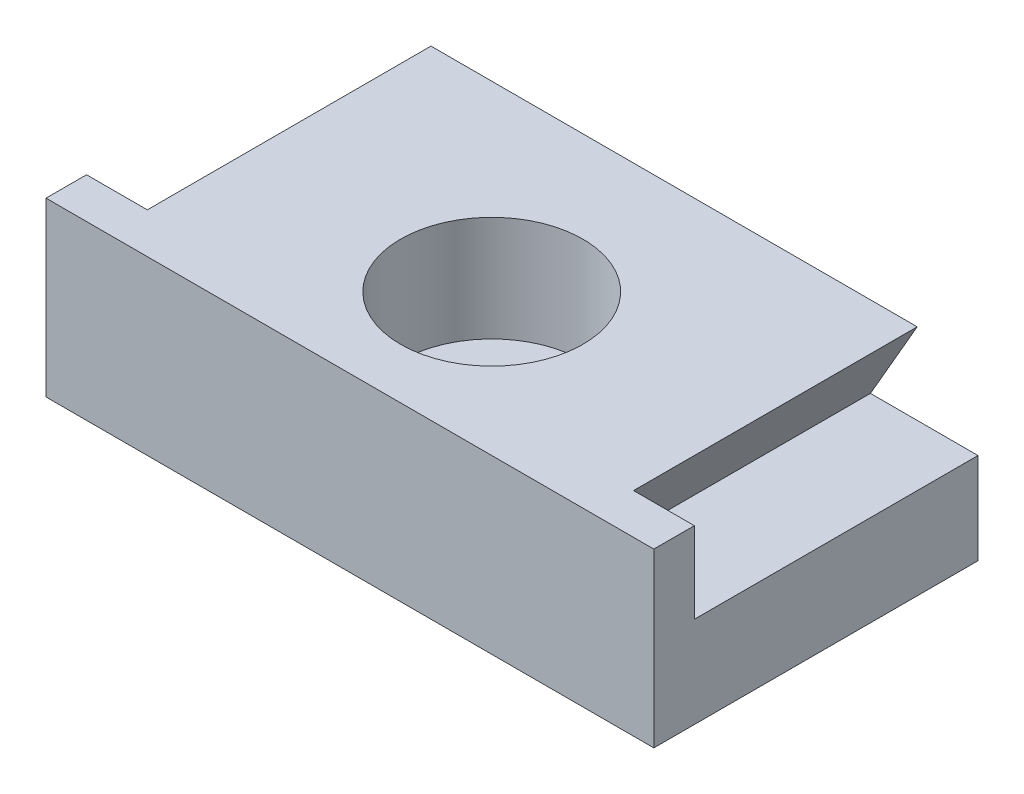
ISO-10303-21;
HEADER;
FILE_DESCRIPTION(('STEP AP214'),'2;1');
FILE_NAME('part.step','',(''),(''),'','','');
FILE_SCHEMA(('AUTOMOTIVE_DESIGN { 1 0 10303 214 1 1 1 1 }'));
ENDSEC;
DATA;
#1=APPLICATION_CONTEXT('core data for automotive mechanical design processes');
#2=APPLICATION_PROTOCOL_DEFINITION('international standard','automotive_design',2000,#1);
#3=PRODUCT_CONTEXT('',#1,'mechanical');
#4=PRODUCT('Part','Part','',(#3));
#5=PRODUCT_RELATED_PRODUCT_CATEGORY('part','',(#4));
#6=PRODUCT_DEFINITION_FORMATION('','',#4);
#7=PRODUCT_DEFINITION_CONTEXT('part definition',#1,'design');
#8=PRODUCT_DEFINITION('design','',#6,#7);
#9=PRODUCT_DEFINITION_SHAPE('','',#8);
#10=(LENGTH_UNIT() NAMED_UNIT(*) SI_UNIT(.MILLI.,.METRE.));
#11=(NAMED_UNIT(*) PLANE_ANGLE_UNIT() SI_UNIT($,.RADIAN.));
#12=(NAMED_UNIT(*) SI_UNIT($,.STERADIAN.) SOLID_ANGLE_UNIT());
#13=UNCERTAINTY_MEASURE_WITH_UNIT(LENGTH_MEASURE(1.E-05),#10,'distance_accuracy_value','');
#14=(GEOMETRIC_REPRESENTATION_CONTEXT(3) GLOBAL_UNCERTAINTY_ASSIGNED_CONTEXT((#13)) GLOBAL_UNIT_ASSIGNED_CONTEXT((#10,
#11,#12)) REPRESENTATION_CONTEXT('',''));
#15=CARTESIAN_POINT('',(0.,0.,0.));
#16=DIRECTION('',(0.,0.,1.));
#17=DIRECTION('',(1.,0.,0.));
#18=AXIS2_PLACEMENT_3D('',#15,#16,#17);
#19=CARTESIAN_POINT('',(0.,8.5,0.));
#20=DIRECTION('',(1.,0.,0.));
#21=DIRECTION('',(0.,0.,-1.));
#22=AXIS2_PLACEMENT_3D('',#19,#20,#21);
#23=PLANE('',#22);
#24=DIRECTION('',(0.,1.,0.));
#25=VECTOR('',#24,1.);
#26=CARTESIAN_POINT('',(0.,4.49888084708997,-2.));
#27=LINE('',#26,#25);
#28=CARTESIAN_POINT('',(0.,4.49888084708997,-2.));
#29=VERTEX_POINT('',#28);
#30=CARTESIAN_POINT('',(0.,8.5,-2.));
#31=VERTEX_POINT('',#30);
#32=EDGE_CURVE('E66',#29,#31,#27,.T.);
#33=ORIENTED_EDGE('',*,*,#32,.F.);
#34=DIRECTION('',(0.,0.,-1.));
#35=VECTOR('',#34,1.);
#36=CARTESIAN_POINT('',(0.,4.49888084708997,-2.));
#37=LINE('',#36,#35);
#38=CARTESIAN_POINT('',(0.,4.49888084708997,-16.));
#39=VERTEX_POINT('',#38);
#40=EDGE_CURVE('E224',#29,#39,#37,.T.);
#41=ORIENTED_EDGE('',*,*,#40,.T.);
#42=DIRECTION('',(0.,-1.,0.));
#43=VECTOR('',#42,1.);
#44=CARTESIAN_POINT('',(0.,8.5,-16.));
#45=LINE('',#44,#43);
#46=CARTESIAN_POINT('',(0.,0.,-16.));
#47=VERTEX_POINT('',#46);
#48=EDGE_CURVE('E153',#39,#47,#45,.T.);
#49=ORIENTED_EDGE('',*,*,#48,.T.);
#50=DIRECTION('',(0.,0.,1.));
#51=VECTOR('',#50,1.);
#52=CARTESIAN_POINT('',(0.,0.,0.));
#53=LINE('',#52,#51);
#54=CARTESIAN_POINT('',(0.,0.,0.));
#55=VERTEX_POINT('',#54);
#56=EDGE_CURVE('E159',#47,#55,#53,.T.);
#57=ORIENTED_EDGE('',*,*,#56,.T.);
#58=DIRECTION('',(0.,-1.,0.));
#59=VECTOR('',#58,1.);
#60=CARTESIAN_POINT('',(0.,8.5,0.));
#61=LINE('',#60,#59);
#62=CARTESIAN_POINT('',(0.,8.5,0.));
#63=VERTEX_POINT('',#62);
#64=EDGE_CURVE('E11',#63,#55,#61,.T.);
#65=ORIENTED_EDGE('',*,*,#64,.F.);
#66=DIRECTION('',(0.,0.,1.));
#67=VECTOR('',#66,1.);
#68=CARTESIAN_POINT('',(0.,8.5,0.));
#69=LINE('',#68,#67);
#70=EDGE_CURVE('E155',#31,#63,#69,.T.);
#71=ORIENTED_EDGE('',*,*,#70,.F.);
#72=EDGE_LOOP('',(#33,#41,#49,#57,#65,#71));
#73=FACE_BOUND('',#72,.T.);
#74=ADVANCED_FACE('F43',(#73),#23,.F.);
#75=CARTESIAN_POINT('',(0.,8.5,0.));
#76=DIRECTION('',(0.,0.,-1.));
#77=DIRECTION('',(-1.,0.,0.));
#78=AXIS2_PLACEMENT_3D('',#75,#76,#77);
#79=PLANE('',#78);
#80=DIRECTION('',(1.,0.,0.));
#81=VECTOR('',#80,1.);
#82=CARTESIAN_POINT('',(0.,0.,0.));
#83=LINE('',#82,#81);
#84=CARTESIAN_POINT('',(30.,0.,0.));
#85=VERTEX_POINT('',#84);
#86=EDGE_CURVE('E163',#55,#85,#83,.T.);
#87=ORIENTED_EDGE('',*,*,#86,.T.);
#88=DIRECTION('',(0.,-1.,0.));
#89=VECTOR('',#88,1.);
#90=CARTESIAN_POINT('',(30.,8.5,0.));
#91=LINE('',#90,#89);
#92=CARTESIAN_POINT('',(30.,8.5,0.));
#93=VERTEX_POINT('',#92);
#94=EDGE_CURVE('E51',#93,#85,#91,.T.);
#95=ORIENTED_EDGE('',*,*,#94,.F.);
#96=DIRECTION('',(1.,0.,0.));
#97=VECTOR('',#96,1.);
#98=CARTESIAN_POINT('',(0.,8.5,0.));
#99=LINE('',#98,#97);
#100=EDGE_CURVE('E145',#63,#93,#99,.T.);
#101=ORIENTED_EDGE('',*,*,#100,.F.);
#102=ORIENTED_EDGE('',*,*,#64,.T.);
#103=EDGE_LOOP('',(#87,#95,#101,#102));
#104=FACE_BOUND('',#103,.T.);
#105=ADVANCED_FACE('F260',(#104),#79,.F.);
#106=CARTESIAN_POINT('',(30.,8.5,0.));
#107=DIRECTION('',(-1.,0.,0.));
#108=DIRECTION('',(0.,0.,1.));
#109=AXIS2_PLACEMENT_3D('',#106,#107,#108);
#110=PLANE('',#109);
#111=DIRECTION('',(0.,-1.,0.));
#112=VECTOR('',#111,1.);
#113=CARTESIAN_POINT('',(30.,8.5,-16.));
#114=LINE('',#113,#112);
#115=CARTESIAN_POINT('',(30.,4.49888084708996,-16.));
#116=VERTEX_POINT('',#115);
#117=CARTESIAN_POINT('',(30.,0.,-16.));
#118=VERTEX_POINT('',#117);
#119=EDGE_CURVE('E177',#116,#118,#114,.T.);
#120=ORIENTED_EDGE('',*,*,#119,.F.);
#121=DIRECTION('',(0.,0.,-1.));
#122=VECTOR('',#121,1.);
#123=CARTESIAN_POINT('',(30.,4.49888084708996,-2.));
#124=LINE('',#123,#122);
#125=CARTESIAN_POINT('',(30.,4.49888084708996,-2.));
#126=VERTEX_POINT('',#125);
#127=EDGE_CURVE('E139',#126,#116,#124,.T.);
#128=ORIENTED_EDGE('',*,*,#127,.F.);
#129=DIRECTION('',(0.,-1.,0.));
#130=VECTOR('',#129,1.);
#131=CARTESIAN_POINT('',(30.,4.49888084708996,-2.));
#132=LINE('',#131,#130);
#133=CARTESIAN_POINT('',(30.,8.5,-2.));
#134=VERTEX_POINT('',#133);
#135=EDGE_CURVE('E125',#134,#126,#132,.T.);
#136=ORIENTED_EDGE('',*,*,#135,.F.);
#137=DIRECTION('',(0.,0.,-1.));
#138=VECTOR('',#137,1.);
#139=CARTESIAN_POINT('',(30.,8.5,0.));
#140=LINE('',#139,#138);
#141=EDGE_CURVE('E138',#93,#134,#140,.T.);
#142=ORIENTED_EDGE('',*,*,#141,.F.);
#143=ORIENTED_EDGE('',*,*,#94,.T.);
#144=DIRECTION('',(0.,0.,-1.));
#145=VECTOR('',#144,1.);
#146=CARTESIAN_POINT('',(30.,0.,0.));
#147=LINE('',#146,#145);
#148=EDGE_CURVE('E167',#85,#118,#147,.T.);
#149=ORIENTED_EDGE('',*,*,#148,.T.);
#150=EDGE_LOOP('',(#120,#128,#136,#142,#143,#149));
#151=FACE_BOUND('',#150,.T.);
#152=ADVANCED_FACE('F136',(#151),#110,.F.);
#153=CARTESIAN_POINT('',(0.,8.5,-16.));
#154=DIRECTION('',(0.,0.,1.));
#155=DIRECTION('',(1.,0.,0.));
#156=AXIS2_PLACEMENT_3D('',#153,#154,#155);
#157=PLANE('',#156);
#158=CARTESIAN_POINT('',(21.5,4.25,-16.));
#159=DIRECTION('',(0.,0.,-1.));
#160=DIRECTION('',(-1.,0.,0.));
#161=AXIS2_PLACEMENT_3D('',#158,#159,#160);
#162=CIRCLE('',#161,2.1);
#163=CARTESIAN_POINT('',(19.4,4.25,-16.));
#164=VERTEX_POINT('',#163);
#165=EDGE_CURVE('E283',#164,#164,#162,.T.);
#166=ORIENTED_EDGE('',*,*,#165,.F.);
#167=EDGE_LOOP('',(#166));
#168=FACE_BOUND('',#167,.T.);
#169=CARTESIAN_POINT('',(8.5,4.25,-16.));
#170=DIRECTION('',(0.,0.,-1.));
#171=DIRECTION('',(1.,0.,0.));
#172=AXIS2_PLACEMENT_3D('',#169,#170,#171);
#173=CIRCLE('',#172,2.1);
#174=CARTESIAN_POINT('',(10.6,4.25,-16.));
#175=VERTEX_POINT('',#174);
#176=EDGE_CURVE('E278',#175,#175,#173,.T.);
#177=ORIENTED_EDGE('',*,*,#176,.F.);
#178=EDGE_LOOP('',(#177));
#179=FACE_BOUND('',#178,.T.);
#180=DIRECTION('',(-1.,0.,0.));
#181=VECTOR('',#180,1.);
#182=CARTESIAN_POINT('',(0.,8.5,-16.));
#183=LINE('',#182,#181);
#184=CARTESIAN_POINT('',(27.,8.5,-16.));
#185=VERTEX_POINT('',#184);
#186=CARTESIAN_POINT('',(3.,8.50000000000001,-16.));
#187=VERTEX_POINT('',#186);
#188=EDGE_CURVE('E148',#185,#187,#183,.T.);
#189=ORIENTED_EDGE('',*,*,#188,.F.);
#190=DIRECTION('',(0.500000000000005,0.866025403784436,0.));
#191=VECTOR('',#190,1.);
#192=CARTESIAN_POINT('',(27.,8.5,-16.));
#193=LINE('',#192,#191);
#194=CARTESIAN_POINT('',(24.6899527800076,4.49888084708997,-16.));
#195=VERTEX_POINT('',#194);
#196=EDGE_CURVE('E131',#195,#185,#193,.T.);
#197=ORIENTED_EDGE('',*,*,#196,.F.);
#198=DIRECTION('',(-1.,0.,0.));
#199=VECTOR('',#198,1.);
#200=CARTESIAN_POINT('',(24.6899527800076,4.49888084708997,-16.));
#201=LINE('',#200,#199);
#202=EDGE_CURVE('E194',#116,#195,#201,.T.);
#203=ORIENTED_EDGE('',*,*,#202,.F.);
#204=ORIENTED_EDGE('',*,*,#119,.T.);
#205=DIRECTION('',(-1.,0.,0.));
#206=VECTOR('',#205,1.);
#207=CARTESIAN_POINT('',(0.,0.,-16.));
#208=LINE('',#207,#206);
#209=EDGE_CURVE('E171',#118,#47,#208,.T.);
#210=ORIENTED_EDGE('',*,*,#209,.T.);
#211=ORIENTED_EDGE('',*,*,#48,.F.);
#212=DIRECTION('',(-1.,0.,0.));
#213=VECTOR('',#212,1.);
#214=CARTESIAN_POINT('',(5.3100472199924,4.49888084708997,-16.));
#215=LINE('',#214,#213);
#216=CARTESIAN_POINT('',(5.3100472199924,4.49888084708997,-16.));
#217=VERTEX_POINT('',#216);
#218=EDGE_CURVE('E203',#217,#39,#215,.T.);
#219=ORIENTED_EDGE('',*,*,#218,.F.);
#220=DIRECTION('',(0.500000000000004,-0.866025403784436,0.));
#221=VECTOR('',#220,1.);
#222=CARTESIAN_POINT('',(3.,8.50000000000001,-16.));
#223=LINE('',#222,#221);
#224=EDGE_CURVE('E197',#187,#217,#223,.T.);
#225=ORIENTED_EDGE('',*,*,#224,.F.);
#226=EDGE_LOOP('',(#189,#197,#203,#204,#210,#211,#219,#225));
#227=FACE_BOUND('',#226,.T.);
#228=ADVANCED_FACE('F189',(#168,#179,#227),#157,.F.);
#229=CARTESIAN_POINT('',(0.,8.5,0.));
#230=DIRECTION('',(0.,-1.,0.));
#231=DIRECTION('',(0.,0.,-1.));
#232=AXIS2_PLACEMENT_3D('',#229,#230,#231);
#233=PLANE('',#232);
#234=CARTESIAN_POINT('',(15.,8.5,-7.));
#235=DIRECTION('',(0.,1.,0.));
#236=DIRECTION('',(0.,0.,1.));
#237=AXIS2_PLACEMENT_3D('',#234,#235,#236);
#238=CIRCLE('',#237,4.5);
#239=CARTESIAN_POINT('',(15.,8.5,-2.5));
#240=VERTEX_POINT('',#239);
#241=EDGE_CURVE('E246',#240,#240,#238,.T.);
#242=ORIENTED_EDGE('',*,*,#241,.F.);
#243=EDGE_LOOP('',(#242));
#244=FACE_BOUND('',#243,.T.);
#245=DIRECTION('',(1.,0.,0.));
#246=VECTOR('',#245,1.);
#247=CARTESIAN_POINT('',(30.,8.5,-2.));
#248=LINE('',#247,#246);
#249=CARTESIAN_POINT('',(27.,8.5,-2.));
#250=VERTEX_POINT('',#249);
#251=EDGE_CURVE('E122',#250,#134,#248,.T.);
#252=ORIENTED_EDGE('',*,*,#251,.F.);
#253=DIRECTION('',(0.,0.,-1.));
#254=VECTOR('',#253,1.);
#255=CARTESIAN_POINT('',(27.,8.5,-2.));
#256=LINE('',#255,#254);
#257=EDGE_CURVE('E208',#250,#185,#256,.T.);
#258=ORIENTED_EDGE('',*,*,#257,.T.);
#259=ORIENTED_EDGE('',*,*,#188,.T.);
#260=DIRECTION('',(0.,0.,-1.));
#261=VECTOR('',#260,1.);
#262=CARTESIAN_POINT('',(3.,8.50000000000001,-2.));
#263=LINE('',#262,#261);
#264=CARTESIAN_POINT('',(3.,8.50000000000001,-2.));
#265=VERTEX_POINT('',#264);
#266=EDGE_CURVE('E217',#265,#187,#263,.T.);
#267=ORIENTED_EDGE('',*,*,#266,.F.);
#268=DIRECTION('',(1.,0.,0.));
#269=VECTOR('',#268,1.);
#270=CARTESIAN_POINT('',(0.,8.5,-2.));
#271=LINE('',#270,#269);
#272=EDGE_CURVE('E237',#31,#265,#271,.T.);
#273=ORIENTED_EDGE('',*,*,#272,.F.);
#274=ORIENTED_EDGE('',*,*,#70,.T.);
#275=ORIENTED_EDGE('',*,*,#100,.T.);
#276=ORIENTED_EDGE('',*,*,#141,.T.);
#277=EDGE_LOOP('',(#252,#258,#259,#267,#273,#274,#275,#276));
#278=FACE_BOUND('',#277,.T.);
#279=ADVANCED_FACE('F143',(#244,#278),#233,.F.);
#280=CARTESIAN_POINT('',(0.,0.,0.));
#281=DIRECTION('',(0.,-1.,0.));
#282=DIRECTION('',(0.,0.,-1.));
#283=AXIS2_PLACEMENT_3D('',#280,#281,#282);
#284=PLANE('',#283);
#285=CARTESIAN_POINT('',(10.1192259751539,0.,-7.));
#286=DIRECTION('',(0.,-1.,0.));
#287=DIRECTION('',(0.,0.,-1.));
#288=AXIS2_PLACEMENT_3D('',#285,#286,#287);
#289=CIRCLE('',#288,1.1);
#290=CARTESIAN_POINT('',(10.1192259751539,0.,-8.1));
#291=VERTEX_POINT('',#290);
#292=EDGE_CURVE('E298',#291,#291,#289,.T.);
#293=ORIENTED_EDGE('',*,*,#292,.F.);
#294=EDGE_LOOP('',(#293));
#295=FACE_BOUND('',#294,.T.);
#296=CARTESIAN_POINT('',(19.8807740248461,0.,-7.));
#297=DIRECTION('',(0.,-1.,0.));
#298=DIRECTION('',(0.,0.,-1.));
#299=AXIS2_PLACEMENT_3D('',#296,#297,#298);
#300=CIRCLE('',#299,1.1);
#301=CARTESIAN_POINT('',(19.8807740248461,0.,-8.1));
#302=VERTEX_POINT('',#301);
#303=EDGE_CURVE('E294',#302,#302,#300,.T.);
#304=ORIENTED_EDGE('',*,*,#303,.F.);
#305=EDGE_LOOP('',(#304));
#306=FACE_BOUND('',#305,.T.);
#307=CARTESIAN_POINT('',(15.,0.,-7.));
#308=DIRECTION('',(0.,1.,0.));
#309=DIRECTION('',(0.,0.,1.));
#310=AXIS2_PLACEMENT_3D('',#307,#308,#309);
#311=CIRCLE('',#310,2.65);
#312=CARTESIAN_POINT('',(15.,0.,-4.35));
#313=VERTEX_POINT('',#312);
#314=EDGE_CURVE('E242',#313,#313,#311,.T.);
#315=ORIENTED_EDGE('',*,*,#314,.T.);
#316=EDGE_LOOP('',(#315));
#317=FACE_BOUND('',#316,.T.);
#318=ORIENTED_EDGE('',*,*,#56,.F.);
#319=ORIENTED_EDGE('',*,*,#209,.F.);
#320=ORIENTED_EDGE('',*,*,#148,.F.);
#321=ORIENTED_EDGE('',*,*,#86,.F.);
#322=EDGE_LOOP('',(#318,#319,#320,#321));
#323=FACE_BOUND('',#322,.T.);
#324=ADVANCED_FACE('F185',(#295,#306,#317,#323),#284,.T.);
#325=CARTESIAN_POINT('',(15.,3.3,-7.));
#326=DIRECTION('',(0.,1.,0.));
#327=DIRECTION('',(0.,0.,1.));
#328=AXIS2_PLACEMENT_3D('',#325,#326,#327);
#329=CYLINDRICAL_SURFACE('',#328,4.5);
#330=CARTESIAN_POINT('',(15.,3.3,-7.));
#331=DIRECTION('',(0.,1.,0.));
#332=DIRECTION('',(0.,0.,1.));
#333=AXIS2_PLACEMENT_3D('',#330,#331,#332);
#334=CIRCLE('',#333,4.5);
#335=CARTESIAN_POINT('',(15.,3.3,-2.5));
#336=VERTEX_POINT('',#335);
#337=EDGE_CURVE('E164',#336,#336,#334,.T.);
#338=ORIENTED_EDGE('',*,*,#337,.F.);
#339=EDGE_LOOP('',(#338));
#340=FACE_BOUND('',#339,.T.);
#341=ORIENTED_EDGE('',*,*,#241,.T.);
#342=EDGE_LOOP('',(#341));
#343=FACE_BOUND('',#342,.T.);
#344=ADVANCED_FACE('F317',(#340,#343),#329,.F.);
#345=CARTESIAN_POINT('',(15.,3.3,-7.));
#346=DIRECTION('',(0.,1.,0.));
#347=DIRECTION('',(0.,0.,1.));
#348=AXIS2_PLACEMENT_3D('',#345,#346,#347);
#349=PLANE('',#348);
#350=CARTESIAN_POINT('',(15.,3.3,-7.));
#351=DIRECTION('',(0.,1.,0.));
#352=DIRECTION('',(0.,0.,1.));
#353=AXIS2_PLACEMENT_3D('',#350,#351,#352);
#354=CIRCLE('',#353,2.65);
#355=CARTESIAN_POINT('',(15.,3.3,-4.35));
#356=VERTEX_POINT('',#355);
#357=EDGE_CURVE('E211',#356,#356,#354,.T.);
#358=ORIENTED_EDGE('',*,*,#357,.F.);
#359=EDGE_LOOP('',(#358));
#360=FACE_BOUND('',#359,.T.);
#361=ORIENTED_EDGE('',*,*,#337,.T.);
#362=EDGE_LOOP('',(#361));
#363=FACE_BOUND('',#362,.T.);
#364=ADVANCED_FACE('F326',(#360,#363),#349,.T.);
#365=CARTESIAN_POINT('',(15.,0.,-7.));
#366=DIRECTION('',(0.,1.,0.));
#367=DIRECTION('',(0.,0.,1.));
#368=AXIS2_PLACEMENT_3D('',#365,#366,#367);
#369=CYLINDRICAL_SURFACE('',#368,2.65);
#370=ORIENTED_EDGE('',*,*,#314,.F.);
#371=EDGE_LOOP('',(#370));
#372=FACE_BOUND('',#371,.T.);
#373=ORIENTED_EDGE('',*,*,#357,.T.);
#374=EDGE_LOOP('',(#373));
#375=FACE_BOUND('',#374,.T.);
#376=ADVANCED_FACE('F323',(#372,#375),#369,.F.);
#377=CARTESIAN_POINT('',(5.3100472199924,4.49888084708997,-2.));
#378=DIRECTION('',(0.,-1.,0.));
#379=DIRECTION('',(1.,0.,0.));
#380=AXIS2_PLACEMENT_3D('',#377,#378,#379);
#381=PLANE('',#380);
#382=ORIENTED_EDGE('',*,*,#218,.T.);
#383=ORIENTED_EDGE('',*,*,#40,.F.);
#384=DIRECTION('',(-1.,0.,0.));
#385=VECTOR('',#384,1.);
#386=CARTESIAN_POINT('',(5.3100472199924,4.49888084708997,-2.));
#387=LINE('',#386,#385);
#388=CARTESIAN_POINT('',(5.3100472199924,4.49888084708997,-2.));
#389=VERTEX_POINT('',#388);
#390=EDGE_CURVE('E220',#389,#29,#387,.T.);
#391=ORIENTED_EDGE('',*,*,#390,.F.);
#392=DIRECTION('',(0.,0.,-1.));
#393=VECTOR('',#392,1.);
#394=CARTESIAN_POINT('',(5.3100472199924,4.49888084708997,-2.));
#395=LINE('',#394,#393);
#396=EDGE_CURVE('E221',#389,#217,#395,.T.);
#397=ORIENTED_EDGE('',*,*,#396,.T.);
#398=EDGE_LOOP('',(#382,#383,#391,#397));
#399=FACE_BOUND('',#398,.T.);
#400=ADVANCED_FACE('F263',(#399),#381,.F.);
#401=CARTESIAN_POINT('',(3.,8.50000000000001,-2.));
#402=DIRECTION('',(0.866025403784436,0.500000000000004,0.));
#403=DIRECTION('',(-0.500000000000005,0.866025403784436,0.));
#404=AXIS2_PLACEMENT_3D('',#401,#402,#403);
#405=PLANE('',#404);
#406=ORIENTED_EDGE('',*,*,#224,.T.);
#407=ORIENTED_EDGE('',*,*,#396,.F.);
#408=DIRECTION('',(0.500000000000004,-0.866025403784436,0.));
#409=VECTOR('',#408,1.);
#410=CARTESIAN_POINT('',(3.,8.50000000000001,-2.));
#411=LINE('',#410,#409);
#412=EDGE_CURVE('E233',#265,#389,#411,.T.);
#413=ORIENTED_EDGE('',*,*,#412,.F.);
#414=ORIENTED_EDGE('',*,*,#266,.T.);
#415=EDGE_LOOP('',(#406,#407,#413,#414));
#416=FACE_BOUND('',#415,.T.);
#417=ADVANCED_FACE('F266',(#416),#405,.F.);
#418=CARTESIAN_POINT('',(0.,0.,-2.));
#419=DIRECTION('',(0.,0.,-1.));
#420=DIRECTION('',(-1.,0.,0.));
#421=AXIS2_PLACEMENT_3D('',#418,#419,#420);
#422=PLANE('',#421);
#423=ORIENTED_EDGE('',*,*,#32,.T.);
#424=ORIENTED_EDGE('',*,*,#272,.T.);
#425=ORIENTED_EDGE('',*,*,#412,.T.);
#426=ORIENTED_EDGE('',*,*,#390,.T.);
#427=EDGE_LOOP('',(#423,#424,#425,#426));
#428=FACE_BOUND('',#427,.T.);
#429=ADVANCED_FACE('F264',(#428),#422,.T.);
#430=CARTESIAN_POINT('',(27.,8.5,-2.));
#431=DIRECTION('',(-0.866025403784436,0.500000000000005,0.));
#432=DIRECTION('',(-0.500000000000005,-0.866025403784436,0.));
#433=AXIS2_PLACEMENT_3D('',#430,#431,#432);
#434=PLANE('',#433);
#435=ORIENTED_EDGE('',*,*,#196,.T.);
#436=ORIENTED_EDGE('',*,*,#257,.F.);
#437=DIRECTION('',(0.500000000000005,0.866025403784436,0.));
#438=VECTOR('',#437,1.);
#439=CARTESIAN_POINT('',(27.,8.5,-2.));
#440=LINE('',#439,#438);
#441=CARTESIAN_POINT('',(24.6899527800076,4.49888084708997,-2.));
#442=VERTEX_POINT('',#441);
#443=EDGE_CURVE('E58',#442,#250,#440,.T.);
#444=ORIENTED_EDGE('',*,*,#443,.F.);
#445=DIRECTION('',(0.,0.,-1.));
#446=VECTOR('',#445,1.);
#447=CARTESIAN_POINT('',(24.6899527800076,4.49888084708997,-2.));
#448=LINE('',#447,#446);
#449=EDGE_CURVE('E212',#442,#195,#448,.T.);
#450=ORIENTED_EDGE('',*,*,#449,.T.);
#451=EDGE_LOOP('',(#435,#436,#444,#450));
#452=FACE_BOUND('',#451,.T.);
#453=ADVANCED_FACE('F269',(#452),#434,.F.);
#454=CARTESIAN_POINT('',(24.6899527800076,4.49888084708997,-2.));
#455=DIRECTION('',(0.,-1.,0.));
#456=DIRECTION('',(1.,0.,0.));
#457=AXIS2_PLACEMENT_3D('',#454,#455,#456);
#458=PLANE('',#457);
#459=ORIENTED_EDGE('',*,*,#202,.T.);
#460=ORIENTED_EDGE('',*,*,#449,.F.);
#461=DIRECTION('',(-1.,0.,0.));
#462=VECTOR('',#461,1.);
#463=CARTESIAN_POINT('',(24.6899527800076,4.49888084708997,-2.));
#464=LINE('',#463,#462);
#465=EDGE_CURVE('E141',#126,#442,#464,.T.);
#466=ORIENTED_EDGE('',*,*,#465,.F.);
#467=ORIENTED_EDGE('',*,*,#127,.T.);
#468=EDGE_LOOP('',(#459,#460,#466,#467));
#469=FACE_BOUND('',#468,.T.);
#470=ADVANCED_FACE('F270',(#469),#458,.F.);
#471=CARTESIAN_POINT('',(0.,0.,-2.));
#472=DIRECTION('',(0.,0.,-1.));
#473=DIRECTION('',(-1.,0.,0.));
#474=AXIS2_PLACEMENT_3D('',#471,#472,#473);
#475=PLANE('',#474);
#476=ORIENTED_EDGE('',*,*,#251,.T.);
#477=ORIENTED_EDGE('',*,*,#135,.T.);
#478=ORIENTED_EDGE('',*,*,#465,.T.);
#479=ORIENTED_EDGE('',*,*,#443,.T.);
#480=EDGE_LOOP('',(#476,#477,#478,#479));
#481=FACE_BOUND('',#480,.T.);
#482=ADVANCED_FACE('F124',(#481),#475,.T.);
#483=CARTESIAN_POINT('',(8.5,4.25,-9.));
#484=DIRECTION('',(0.,0.,-1.));
#485=DIRECTION('',(-1.,0.,0.));
#486=AXIS2_PLACEMENT_3D('',#483,#484,#485);
#487=CYLINDRICAL_SURFACE('',#486,2.1);
#488=CARTESIAN_POINT('',(8.5,4.25,-9.));
#489=DIRECTION('',(0.,0.,-1.));
#490=DIRECTION('',(1.,0.,0.));
#491=AXIS2_PLACEMENT_3D('',#488,#489,#490);
#492=CIRCLE('',#491,2.1);
#493=CARTESIAN_POINT('',(10.6,4.25,-9.));
#494=VERTEX_POINT('',#493);
#495=EDGE_CURVE('E274',#494,#494,#492,.T.);
#496=ORIENTED_EDGE('',*,*,#495,.F.);
#497=EDGE_LOOP('',(#496));
#498=FACE_BOUND('',#497,.T.);
#499=ORIENTED_EDGE('',*,*,#176,.T.);
#500=EDGE_LOOP('',(#499));
#501=FACE_BOUND('',#500,.T.);
#502=ADVANCED_FACE('F373',(#498,#501),#487,.F.);
#503=CARTESIAN_POINT('',(8.5,4.25,-9.));
#504=DIRECTION('',(0.,0.,1.));
#505=DIRECTION('',(1.,0.,0.));
#506=AXIS2_PLACEMENT_3D('',#503,#504,#505);
#507=PLANE('',#506);
#508=ORIENTED_EDGE('',*,*,#495,.T.);
#509=EDGE_LOOP('',(#508));
#510=FACE_BOUND('',#509,.T.);
#511=ADVANCED_FACE('F378',(#510),#507,.F.);
#512=CARTESIAN_POINT('',(21.5,4.25,-9.));
#513=DIRECTION('',(0.,0.,-1.));
#514=DIRECTION('',(-1.,0.,0.));
#515=AXIS2_PLACEMENT_3D('',#512,#513,#514);
#516=CYLINDRICAL_SURFACE('',#515,2.1);
#517=CARTESIAN_POINT('',(21.5,4.25,-9.));
#518=DIRECTION('',(0.,0.,-1.));
#519=DIRECTION('',(-1.,0.,0.));
#520=AXIS2_PLACEMENT_3D('',#517,#518,#519);
#521=CIRCLE('',#520,2.1);
#522=CARTESIAN_POINT('',(19.4,4.25,-9.));
#523=VERTEX_POINT('',#522);
#524=EDGE_CURVE('E228',#523,#523,#521,.T.);
#525=ORIENTED_EDGE('',*,*,#524,.F.);
#526=EDGE_LOOP('',(#525));
#527=FACE_BOUND('',#526,.T.);
#528=ORIENTED_EDGE('',*,*,#165,.T.);
#529=EDGE_LOOP('',(#528));
#530=FACE_BOUND('',#529,.T.);
#531=ADVANCED_FACE('F389',(#527,#530),#516,.F.);
#532=CARTESIAN_POINT('',(21.5,4.25,-9.));
#533=DIRECTION('',(0.,0.,-1.));
#534=DIRECTION('',(-1.,0.,0.));
#535=AXIS2_PLACEMENT_3D('',#532,#533,#534);
#536=PLANE('',#535);
#537=ORIENTED_EDGE('',*,*,#524,.T.);
#538=EDGE_LOOP('',(#537));
#539=FACE_BOUND('',#538,.T.);
#540=ADVANCED_FACE('F400',(#539),#536,.T.);
#541=CARTESIAN_POINT('',(19.8807740248461,2.5,-7.));
#542=DIRECTION('',(0.,-1.,0.));
#543=DIRECTION('',(0.,0.,-1.));
#544=AXIS2_PLACEMENT_3D('',#541,#542,#543);
#545=CYLINDRICAL_SURFACE('',#544,1.1);
#546=CARTESIAN_POINT('',(19.8807740248461,2.5,-7.));
#547=DIRECTION('',(0.,-1.,0.));
#548=DIRECTION('',(0.,0.,-1.));
#549=AXIS2_PLACEMENT_3D('',#546,#547,#548);
#550=CIRCLE('',#549,1.1);
#551=CARTESIAN_POINT('',(19.8807740248461,2.5,-8.1));
#552=VERTEX_POINT('',#551);
#553=EDGE_CURVE('E290',#552,#552,#550,.T.);
#554=ORIENTED_EDGE('',*,*,#553,.F.);
#555=EDGE_LOOP('',(#554));
#556=FACE_BOUND('',#555,.T.);
#557=ORIENTED_EDGE('',*,*,#303,.T.);
#558=EDGE_LOOP('',(#557));
#559=FACE_BOUND('',#558,.T.);
#560=ADVANCED_FACE('F411',(#556,#559),#545,.F.);
#561=CARTESIAN_POINT('',(19.8807740248461,2.5,-7.));
#562=DIRECTION('',(0.,-1.,0.));
#563=DIRECTION('',(0.,0.,-1.));
#564=AXIS2_PLACEMENT_3D('',#561,#562,#563);
#565=PLANE('',#564);
#566=ORIENTED_EDGE('',*,*,#553,.T.);
#567=EDGE_LOOP('',(#566));
#568=FACE_BOUND('',#567,.T.);
#569=ADVANCED_FACE('F311',(#568),#565,.T.);
#570=CARTESIAN_POINT('',(10.1192259751539,2.5,-7.));
#571=DIRECTION('',(0.,-1.,0.));
#572=DIRECTION('',(0.,0.,-1.));
#573=AXIS2_PLACEMENT_3D('',#570,#571,#572);
#574=CYLINDRICAL_SURFACE('',#573,1.1);
#575=CARTESIAN_POINT('',(10.1192259751539,2.5,-7.));
#576=DIRECTION('',(0.,-1.,0.));
#577=DIRECTION('',(0.,0.,-1.));
#578=AXIS2_PLACEMENT_3D('',#575,#576,#577);
#579=CIRCLE('',#578,1.1);
#580=CARTESIAN_POINT('',(10.1192259751539,2.5,-8.1));
#581=VERTEX_POINT('',#580);
#582=EDGE_CURVE('E279',#581,#581,#579,.T.);
#583=ORIENTED_EDGE('',*,*,#582,.F.);
#584=EDGE_LOOP('',(#583));
#585=FACE_BOUND('',#584,.T.);
#586=ORIENTED_EDGE('',*,*,#292,.T.);
#587=EDGE_LOOP('',(#586));
#588=FACE_BOUND('',#587,.T.);
#589=ADVANCED_FACE('F308',(#585,#588),#574,.F.);
#590=CARTESIAN_POINT('',(10.1192259751539,2.5,-7.));
#591=DIRECTION('',(0.,-1.,0.));
#592=DIRECTION('',(0.,0.,-1.));
#593=AXIS2_PLACEMENT_3D('',#590,#591,#592);
#594=PLANE('',#593);
#595=ORIENTED_EDGE('',*,*,#582,.T.);
#596=EDGE_LOOP('',(#595));
#597=FACE_BOUND('',#596,.T.);
#598=ADVANCED_FACE('F306',(#597),#594,.T.);
#599=CLOSED_SHELL('',(#74,#105,#152,#228,#279,#324,#344,#364,#376,#400,#417,#429,#453,#470,#482,
#502,#511,#531,#540,#560,#569,#589,#598));
#600=MANIFOLD_SOLID_BREP('B2',#599);
#601=ADVANCED_BREP_SHAPE_REPRESENTATION('',(#18,#600),#14);
#602=SHAPE_DEFINITION_REPRESENTATION(#9,#601);
ENDSEC;
END-ISO-10303-21;
